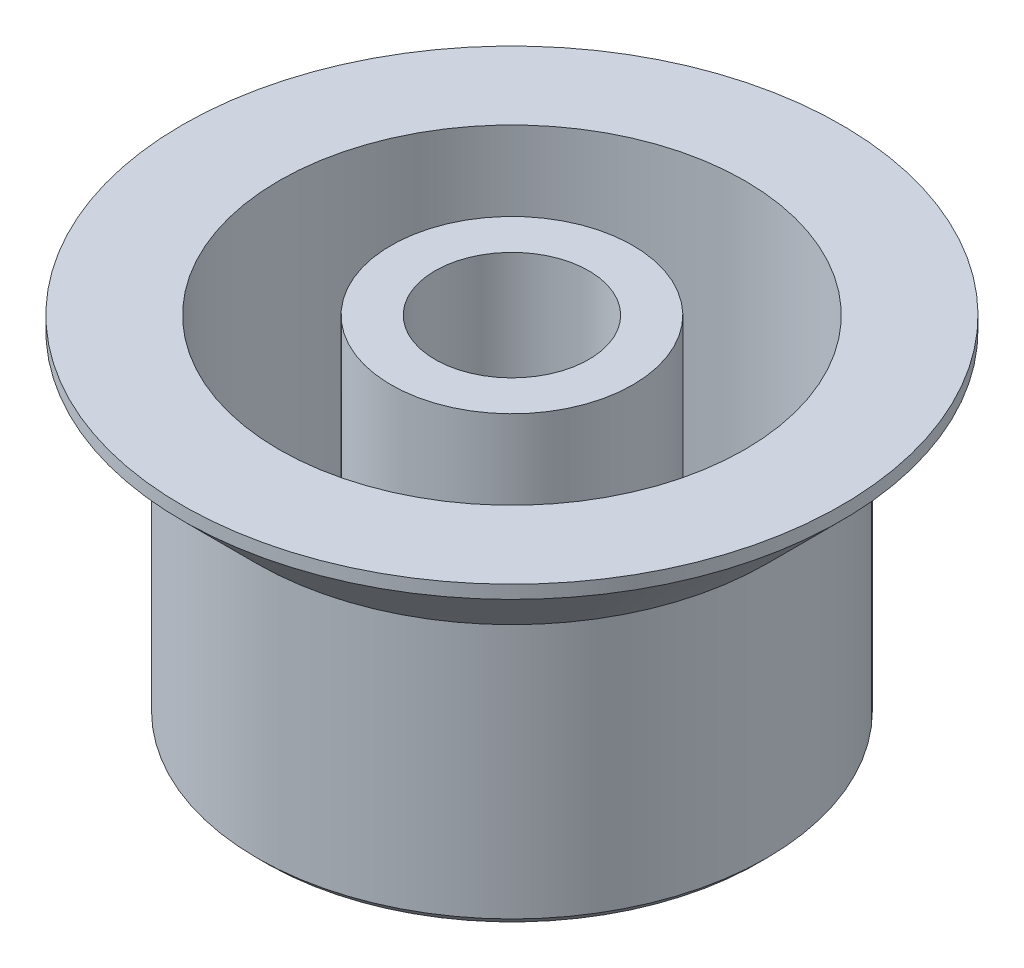
ISO-10303-21;
HEADER;
FILE_DESCRIPTION(('STEP AP214'),'2;1');
FILE_NAME('part.step','',(''),(''),'','','');
FILE_SCHEMA(('AUTOMOTIVE_DESIGN { 1 0 10303 214 1 1 1 1 }'));
ENDSEC;
DATA;
#1=APPLICATION_CONTEXT('core data for automotive mechanical design processes');
#2=APPLICATION_PROTOCOL_DEFINITION('international standard','automotive_design',2000,#1);
#3=PRODUCT_CONTEXT('',#1,'mechanical');
#4=PRODUCT('Part','Part','',(#3));
#5=PRODUCT_RELATED_PRODUCT_CATEGORY('part','',(#4));
#6=PRODUCT_DEFINITION_FORMATION('','',#4);
#7=PRODUCT_DEFINITION_CONTEXT('part definition',#1,'design');
#8=PRODUCT_DEFINITION('design','',#6,#7);
#9=PRODUCT_DEFINITION_SHAPE('','',#8);
#10=(LENGTH_UNIT() NAMED_UNIT(*) SI_UNIT(.MILLI.,.METRE.));
#11=(NAMED_UNIT(*) PLANE_ANGLE_UNIT() SI_UNIT($,.RADIAN.));
#12=(NAMED_UNIT(*) SI_UNIT($,.STERADIAN.) SOLID_ANGLE_UNIT());
#13=UNCERTAINTY_MEASURE_WITH_UNIT(LENGTH_MEASURE(1.E-05),#10,'distance_accuracy_value','');
#14=(GEOMETRIC_REPRESENTATION_CONTEXT(3) GLOBAL_UNCERTAINTY_ASSIGNED_CONTEXT((#13)) GLOBAL_UNIT_ASSIGNED_CONTEXT((#10,
#11,#12)) REPRESENTATION_CONTEXT('',''));
#15=CARTESIAN_POINT('',(0.,0.,0.));
#16=DIRECTION('',(0.,0.,1.));
#17=DIRECTION('',(1.,0.,0.));
#18=AXIS2_PLACEMENT_3D('',#15,#16,#17);
#19=CARTESIAN_POINT('',(166.750080550188,-36.9999315973919,-82.7209999999947));
#20=DIRECTION('',(0.,-1.,0.));
#21=DIRECTION('',(-1.,0.,0.));
#22=AXIS2_PLACEMENT_3D('',#19,#20,#21);
#23=CYLINDRICAL_SURFACE('',#22,5.5);
#24=CARTESIAN_POINT('',(166.750080550188,-36.9999315973919,-82.7209999999947));
#25=DIRECTION('',(0.,1.,0.));
#26=DIRECTION('',(-1.,0.,0.));
#27=AXIS2_PLACEMENT_3D('',#24,#25,#26);
#28=CIRCLE('',#27,5.5);
#29=CARTESIAN_POINT('',(172.250080550188,-36.9999315973919,-82.7209999999947));
#30=VERTEX_POINT('',#29);
#31=EDGE_CURVE('P0_E130',#30,#30,#28,.T.);
#32=ORIENTED_EDGE('',*,*,#31,.F.);
#33=DIRECTION('',(0.,-1.,0.));
#34=VECTOR('',#33,1.);
#35=CARTESIAN_POINT('',(172.250080550188,-36.9999315973919,-82.7209999999947));
#36=LINE('',#35,#34);
#37=CARTESIAN_POINT('',(172.250080550188,-50.9999315973919,-82.7209999999947));
#38=VERTEX_POINT('',#37);
#39=EDGE_CURVE('P0_E11',#30,#38,#36,.T.);
#40=ORIENTED_EDGE('',*,*,#39,.T.);
#41=CARTESIAN_POINT('',(166.750080550188,-50.9999315973919,-82.7209999999947));
#42=DIRECTION('',(0.,1.,0.));
#43=DIRECTION('',(-1.,0.,0.));
#44=AXIS2_PLACEMENT_3D('',#41,#42,#43);
#45=CIRCLE('',#44,5.5);
#46=EDGE_CURVE('P0_E121',#38,#38,#45,.T.);
#47=ORIENTED_EDGE('',*,*,#46,.T.);
#48=ORIENTED_EDGE('',*,*,#39,.F.);
#49=EDGE_LOOP('',(#32,#40,#47,#48));
#50=FACE_BOUND('',#49,.T.);
#51=ADVANCED_FACE('P0_F17',(#50),#23,.T.);
#52=CARTESIAN_POINT('',(166.750080550188,-36.9999315973919,-82.7209999999947));
#53=DIRECTION('',(0.,-1.,0.));
#54=DIRECTION('',(-1.,0.,0.));
#55=AXIS2_PLACEMENT_3D('',#52,#53,#54);
#56=CYLINDRICAL_SURFACE('',#55,10.6);
#57=CARTESIAN_POINT('',(166.750080550188,-36.9999315973919,-82.7209999999947));
#58=DIRECTION('',(0.,-1.,0.));
#59=DIRECTION('',(-1.,0.,0.));
#60=AXIS2_PLACEMENT_3D('',#57,#58,#59);
#61=CIRCLE('',#60,10.6);
#62=CARTESIAN_POINT('',(177.350080550188,-36.9999315973919,-82.7209999999947));
#63=VERTEX_POINT('',#62);
#64=EDGE_CURVE('P0_E122',#63,#63,#61,.T.);
#65=ORIENTED_EDGE('',*,*,#64,.F.);
#66=DIRECTION('',(0.,-1.,0.));
#67=VECTOR('',#66,1.);
#68=CARTESIAN_POINT('',(177.350080550188,-36.9999315973919,-82.7209999999947));
#69=LINE('',#68,#67);
#70=CARTESIAN_POINT('',(177.350080550188,-50.9999315973919,-82.7209999999947));
#71=VERTEX_POINT('',#70);
#72=EDGE_CURVE('P0_E27',#63,#71,#69,.T.);
#73=ORIENTED_EDGE('',*,*,#72,.T.);
#74=CARTESIAN_POINT('',(166.750080550188,-50.9999315973919,-82.7209999999947));
#75=DIRECTION('',(0.,-1.,0.));
#76=DIRECTION('',(-1.,0.,0.));
#77=AXIS2_PLACEMENT_3D('',#74,#75,#76);
#78=CIRCLE('',#77,10.6);
#79=EDGE_CURVE('P0_E118',#71,#71,#78,.T.);
#80=ORIENTED_EDGE('',*,*,#79,.T.);
#81=ORIENTED_EDGE('',*,*,#72,.F.);
#82=EDGE_LOOP('',(#65,#73,#80,#81));
#83=FACE_BOUND('',#82,.T.);
#84=ADVANCED_FACE('P0_F165',(#83),#56,.F.);
#85=CARTESIAN_POINT('',(166.750080550188,-50.9999315973919,-82.7209999999947));
#86=DIRECTION('',(0.,1.,0.));
#87=DIRECTION('',(1.,0.,0.));
#88=AXIS2_PLACEMENT_3D('',#85,#86,#87);
#89=PLANE('',#88);
#90=ORIENTED_EDGE('',*,*,#46,.F.);
#91=EDGE_LOOP('',(#90));
#92=FACE_BOUND('',#91,.T.);
#93=ORIENTED_EDGE('',*,*,#79,.F.);
#94=EDGE_LOOP('',(#93));
#95=FACE_BOUND('',#94,.T.);
#96=ADVANCED_FACE('P0_F161',(#92,#95),#89,.T.);
#97=CARTESIAN_POINT('',(166.750080550188,-36.9999315973919,-82.7209999999947));
#98=DIRECTION('',(0.,1.,0.));
#99=DIRECTION('',(1.,0.,0.));
#100=AXIS2_PLACEMENT_3D('',#97,#98,#99);
#101=PLANE('',#100);
#102=ORIENTED_EDGE('',*,*,#64,.T.);
#103=EDGE_LOOP('',(#102));
#104=FACE_BOUND('',#103,.T.);
#105=CARTESIAN_POINT('',(166.750080550188,-36.9999315973919,-82.7209999999947));
#106=DIRECTION('',(0.,1.,0.));
#107=DIRECTION('',(1.,0.,0.));
#108=AXIS2_PLACEMENT_3D('',#105,#106,#107);
#109=CIRCLE('',#108,15.);
#110=CARTESIAN_POINT('',(151.750080550188,-36.9999315973919,-82.7209999999947));
#111=VERTEX_POINT('',#110);
#112=EDGE_CURVE('P0_E81',#111,#111,#109,.T.);
#113=ORIENTED_EDGE('',*,*,#112,.T.);
#114=EDGE_LOOP('',(#113));
#115=FACE_BOUND('',#114,.T.);
#116=ADVANCED_FACE('P0_F164',(#104,#115),#101,.T.);
#117=CARTESIAN_POINT('',(166.750080550188,-52.9999315973919,-82.7209999999947));
#118=DIRECTION('',(0.,1.,0.));
#119=DIRECTION('',(1.,0.,0.));
#120=AXIS2_PLACEMENT_3D('',#117,#118,#119);
#121=PLANE('',#120);
#122=CARTESIAN_POINT('',(166.750080550188,-52.9999315973919,-82.7209999999947));
#123=DIRECTION('',(0.,1.,0.));
#124=DIRECTION('',(1.,0.,0.));
#125=AXIS2_PLACEMENT_3D('',#122,#123,#124);
#126=CIRCLE('',#125,11.2);
#127=CARTESIAN_POINT('',(155.550080550188,-52.9999315973919,-82.7209999999947));
#128=VERTEX_POINT('',#127);
#129=EDGE_CURVE('P0_E138',#128,#128,#126,.T.);
#130=ORIENTED_EDGE('',*,*,#129,.F.);
#131=EDGE_LOOP('',(#130));
#132=FACE_BOUND('',#131,.T.);
#133=ADVANCED_FACE('P0_F170',(#132),#121,.F.);
#134=CARTESIAN_POINT('',(166.750080550188,-52.7999315973919,-82.7209999999947));
#135=DIRECTION('',(0.,1.,0.));
#136=DIRECTION('',(1.,0.,0.));
#137=AXIS2_PLACEMENT_3D('',#134,#135,#136);
#138=CONICAL_SURFACE('',#137,11.4,0.785398163397437);
#139=ORIENTED_EDGE('',*,*,#129,.T.);
#140=DIRECTION('',(-0.70710678118654,0.707106781186555,0.));
#141=VECTOR('',#140,1.);
#142=CARTESIAN_POINT('',(155.350080550188,-52.7999315973919,-82.7209999999947));
#143=LINE('',#142,#141);
#144=CARTESIAN_POINT('',(155.150080550188,-52.5999315973919,-82.7209999999947));
#145=VERTEX_POINT('',#144);
#146=EDGE_CURVE('P0_E141',#128,#145,#143,.T.);
#147=ORIENTED_EDGE('',*,*,#146,.T.);
#148=CARTESIAN_POINT('',(166.750080550188,-52.5999315973919,-82.7209999999947));
#149=DIRECTION('',(0.,-1.,0.));
#150=DIRECTION('',(1.,0.,0.));
#151=AXIS2_PLACEMENT_3D('',#148,#149,#150);
#152=CIRCLE('',#151,11.6);
#153=EDGE_CURVE('P0_E117',#145,#145,#152,.T.);
#154=ORIENTED_EDGE('',*,*,#153,.T.);
#155=ORIENTED_EDGE('',*,*,#146,.F.);
#156=EDGE_LOOP('',(#139,#147,#154,#155));
#157=FACE_BOUND('',#156,.T.);
#158=ADVANCED_FACE('P0_F176',(#157),#138,.T.);
#159=CARTESIAN_POINT('',(166.750080550188,-52.9999315973919,-82.7209999999947));
#160=DIRECTION('',(0.,1.,0.));
#161=DIRECTION('',(1.,0.,0.));
#162=AXIS2_PLACEMENT_3D('',#159,#160,#161);
#163=CYLINDRICAL_SURFACE('',#162,11.6);
#164=ORIENTED_EDGE('',*,*,#153,.F.);
#165=DIRECTION('',(0.,1.,0.));
#166=VECTOR('',#165,1.);
#167=CARTESIAN_POINT('',(155.150080550188,-52.9999315973919,-82.7209999999947));
#168=LINE('',#167,#166);
#169=CARTESIAN_POINT('',(155.150080550188,-40.9999315973919,-82.7209999999947));
#170=VERTEX_POINT('',#169);
#171=EDGE_CURVE('P0_E135',#145,#170,#168,.T.);
#172=ORIENTED_EDGE('',*,*,#171,.T.);
#173=CARTESIAN_POINT('',(166.750080550188,-40.9999315973919,-82.7209999999947));
#174=DIRECTION('',(0.,-1.,0.));
#175=DIRECTION('',(1.,0.,0.));
#176=AXIS2_PLACEMENT_3D('',#173,#174,#175);
#177=CIRCLE('',#176,11.6);
#178=EDGE_CURVE('P0_E95',#170,#170,#177,.T.);
#179=ORIENTED_EDGE('',*,*,#178,.T.);
#180=ORIENTED_EDGE('',*,*,#171,.F.);
#181=EDGE_LOOP('',(#164,#172,#179,#180));
#182=FACE_BOUND('',#181,.T.);
#183=ADVANCED_FACE('P0_F186',(#182),#163,.T.);
#184=CARTESIAN_POINT('',(166.750080550188,-39.2999315973919,-82.7209999999947));
#185=DIRECTION('',(0.,1.,0.));
#186=DIRECTION('',(1.,0.,0.));
#187=AXIS2_PLACEMENT_3D('',#184,#185,#186);
#188=CONICAL_SURFACE('',#187,13.3,0.785398163397448);
#189=CARTESIAN_POINT('',(166.750080550188,-37.5999315973919,-82.7209999999947));
#190=DIRECTION('',(0.,-1.,0.));
#191=DIRECTION('',(1.,0.,0.));
#192=AXIS2_PLACEMENT_3D('',#189,#190,#191);
#193=CIRCLE('',#192,15.);
#194=CARTESIAN_POINT('',(151.750080550188,-37.5999315973919,-82.7209999999947));
#195=VERTEX_POINT('',#194);
#196=EDGE_CURVE('P0_E93',#195,#195,#193,.T.);
#197=ORIENTED_EDGE('',*,*,#196,.T.);
#198=DIRECTION('',(0.707106781186548,-0.707106781186548,0.));
#199=VECTOR('',#198,1.);
#200=CARTESIAN_POINT('',(153.450080550188,-39.2999315973919,-82.7209999999947));
#201=LINE('',#200,#199);
#202=EDGE_CURVE('P0_E89',#195,#170,#201,.T.);
#203=ORIENTED_EDGE('',*,*,#202,.T.);
#204=ORIENTED_EDGE('',*,*,#178,.F.);
#205=ORIENTED_EDGE('',*,*,#202,.F.);
#206=EDGE_LOOP('',(#197,#203,#204,#205));
#207=FACE_BOUND('',#206,.T.);
#208=ADVANCED_FACE('P0_F91',(#207),#188,.T.);
#209=CARTESIAN_POINT('',(166.750080550188,-36.9999315973919,-82.7209999999947));
#210=DIRECTION('',(0.,-1.,0.));
#211=DIRECTION('',(1.,0.,0.));
#212=AXIS2_PLACEMENT_3D('',#209,#210,#211);
#213=CYLINDRICAL_SURFACE('',#212,15.);
#214=ORIENTED_EDGE('',*,*,#196,.F.);
#215=DIRECTION('',(0.,1.,0.));
#216=VECTOR('',#215,1.);
#217=CARTESIAN_POINT('',(151.750080550188,-36.9999315973919,-82.7209999999947));
#218=LINE('',#217,#216);
#219=EDGE_CURVE('P0_E100',#195,#111,#218,.T.);
#220=ORIENTED_EDGE('',*,*,#219,.T.);
#221=ORIENTED_EDGE('',*,*,#112,.F.);
#222=ORIENTED_EDGE('',*,*,#219,.F.);
#223=EDGE_LOOP('',(#214,#220,#221,#222));
#224=FACE_BOUND('',#223,.T.);
#225=ADVANCED_FACE('P0_F101',(#224),#213,.T.);
#226=CARTESIAN_POINT('',(166.750080550188,-50.9999315973919,-82.7209999999947));
#227=DIRECTION('',(0.,-1.,0.));
#228=DIRECTION('',(0.,0.,-1.));
#229=AXIS2_PLACEMENT_3D('',#226,#227,#228);
#230=PLANE('',#229);
#231=CARTESIAN_POINT('',(166.750080550188,-50.9999315973919,-82.7209999999947));
#232=DIRECTION('',(0.,-1.,0.));
#233=DIRECTION('',(1.,0.,0.));
#234=AXIS2_PLACEMENT_3D('',#231,#232,#233);
#235=CIRCLE('',#234,3.5);
#236=CARTESIAN_POINT('',(163.250080550188,-50.9999315973919,-82.7209999999947));
#237=VERTEX_POINT('',#236);
#238=EDGE_CURVE('P0_E113',#237,#237,#235,.T.);
#239=ORIENTED_EDGE('',*,*,#238,.F.);
#240=EDGE_LOOP('',(#239));
#241=FACE_BOUND('',#240,.T.);
#242=ADVANCED_FACE('P0_F19',(#241),#230,.F.);
#243=CARTESIAN_POINT('',(166.750080550188,-36.9999315973919,-82.7209999999947));
#244=DIRECTION('',(0.,-1.,0.));
#245=DIRECTION('',(1.,0.,0.));
#246=AXIS2_PLACEMENT_3D('',#243,#244,#245);
#247=CYLINDRICAL_SURFACE('',#246,3.5);
#248=ORIENTED_EDGE('',*,*,#238,.T.);
#249=DIRECTION('',(0.,1.,0.));
#250=VECTOR('',#249,1.);
#251=CARTESIAN_POINT('',(163.250080550188,-36.9999315973919,-82.7209999999947));
#252=LINE('',#251,#250);
#253=CARTESIAN_POINT('',(163.250080550188,-36.9999315973919,-82.7209999999947));
#254=VERTEX_POINT('',#253);
#255=EDGE_CURVE('P0_E21',#237,#254,#252,.T.);
#256=ORIENTED_EDGE('',*,*,#255,.T.);
#257=CARTESIAN_POINT('',(166.750080550188,-36.9999315973919,-82.7209999999947));
#258=DIRECTION('',(0.,1.,0.));
#259=DIRECTION('',(1.,0.,0.));
#260=AXIS2_PLACEMENT_3D('',#257,#258,#259);
#261=CIRCLE('',#260,3.5);
#262=EDGE_CURVE('P0_E127',#254,#254,#261,.T.);
#263=ORIENTED_EDGE('',*,*,#262,.T.);
#264=ORIENTED_EDGE('',*,*,#255,.F.);
#265=EDGE_LOOP('',(#248,#256,#263,#264));
#266=FACE_BOUND('',#265,.T.);
#267=ADVANCED_FACE('P0_F194',(#266),#247,.F.);
#268=CARTESIAN_POINT('',(166.750080550188,-36.9999315973919,-82.7209999999947));
#269=DIRECTION('',(0.,1.,0.));
#270=DIRECTION('',(1.,0.,0.));
#271=AXIS2_PLACEMENT_3D('',#268,#269,#270);
#272=PLANE('',#271);
#273=ORIENTED_EDGE('',*,*,#262,.F.);
#274=EDGE_LOOP('',(#273));
#275=FACE_BOUND('',#274,.T.);
#276=ORIENTED_EDGE('',*,*,#31,.T.);
#277=EDGE_LOOP('',(#276));
#278=FACE_BOUND('',#277,.T.);
#279=ADVANCED_FACE('P0_F158',(#275,#278),#272,.T.);
#280=CLOSED_SHELL('',(#51,#84,#96,#116,#133,#158,#183,#208,#225,#242,#267,#279));
#281=MANIFOLD_SOLID_BREP('P0_B1',#280);
#282=CARTESIAN_POINT('',(166.750080550188,-52.9999315973919,-82.7209999999947));
#283=DIRECTION('',(0.,-1.,0.));
#284=DIRECTION('',(1.,0.,0.));
#285=AXIS2_PLACEMENT_3D('',#282,#283,#284);
#286=CYLINDRICAL_SURFACE('',#285,10.8);
#287=CARTESIAN_POINT('',(166.750080550188,-53.0999315973919,-82.7209999999947));
#288=DIRECTION('',(0.,-1.,0.));
#289=DIRECTION('',(1.,0.,0.));
#290=AXIS2_PLACEMENT_3D('',#287,#288,#289);
#291=CIRCLE('',#290,10.8);
#292=CARTESIAN_POINT('',(155.950080550188,-53.0999315973919,-82.7209999999947));
#293=VERTEX_POINT('',#292);
#294=CARTESIAN_POINT('',(166.750080550188,-53.0999315973919,-71.9209999999947));
#295=VERTEX_POINT('',#294);
#296=EDGE_CURVE('P1_E28',#293,#295,#291,.T.);
#297=ORIENTED_EDGE('',*,*,#296,.F.);
#298=DIRECTION('',(0.,1.,0.));
#299=VECTOR('',#298,1.);
#300=CARTESIAN_POINT('',(155.950080550188,-52.9999315973919,-82.7209999999947));
#301=LINE('',#300,#299);
#302=CARTESIAN_POINT('',(155.950080550188,-52.9999315973919,-82.7209999999947));
#303=VERTEX_POINT('',#302);
#304=EDGE_CURVE('P1_E11',#293,#303,#301,.T.);
#305=ORIENTED_EDGE('',*,*,#304,.T.);
#306=CARTESIAN_POINT('',(166.750080550188,-52.9999315973919,-82.7209999999947));
#307=DIRECTION('',(0.,1.,0.));
#308=DIRECTION('',(1.,0.,0.));
#309=AXIS2_PLACEMENT_3D('',#306,#307,#308);
#310=CIRCLE('',#309,10.8);
#311=EDGE_CURVE('P1_E92',#303,#303,#310,.T.);
#312=ORIENTED_EDGE('',*,*,#311,.F.);
#313=ORIENTED_EDGE('',*,*,#304,.F.);
#314=CARTESIAN_POINT('',(166.750080550188,-53.0999315973919,-82.7209999999947));
#315=DIRECTION('',(0.,-1.,0.));
#316=DIRECTION('',(1.,0.,0.));
#317=AXIS2_PLACEMENT_3D('',#314,#315,#316);
#318=CIRCLE('',#317,10.8);
#319=EDGE_CURVE('P1_E82',#295,#293,#318,.T.);
#320=ORIENTED_EDGE('',*,*,#319,.F.);
#321=EDGE_LOOP('',(#297,#305,#312,#313,#320));
#322=FACE_BOUND('',#321,.T.);
#323=ADVANCED_FACE('P1_F17',(#322),#286,.T.);
#324=CARTESIAN_POINT('',(166.750080550188,-53.0999315973919,-82.7209999999947));
#325=DIRECTION('',(0.,-1.,0.));
#326=DIRECTION('',(0.,0.,-1.));
#327=AXIS2_PLACEMENT_3D('',#324,#325,#326);
#328=TOROIDAL_SURFACE('',#327,10.7,0.1);
#329=CARTESIAN_POINT('',(166.750080550188,-53.1999315973919,-82.7209999999947));
#330=DIRECTION('',(0.,1.,0.));
#331=DIRECTION('',(1.,0.,0.));
#332=AXIS2_PLACEMENT_3D('',#329,#330,#331);
#333=CIRCLE('',#332,10.7);
#334=CARTESIAN_POINT('',(166.750080550188,-53.1999315973919,-72.0209999999947));
#335=VERTEX_POINT('',#334);
#336=EDGE_CURVE('P1_E79',#335,#335,#333,.T.);
#337=ORIENTED_EDGE('',*,*,#336,.T.);
#338=CARTESIAN_POINT('',(166.750080550188,-53.0999315973919,-72.0209999999947));
#339=DIRECTION('',(-1.,0.,0.));
#340=DIRECTION('',(0.,0.,1.));
#341=AXIS2_PLACEMENT_3D('',#338,#339,#340);
#342=CIRCLE('',#341,0.1);
#343=EDGE_CURVE('P1_E76',#335,#295,#342,.T.);
#344=ORIENTED_EDGE('',*,*,#343,.T.);
#345=ORIENTED_EDGE('',*,*,#319,.T.);
#346=ORIENTED_EDGE('',*,*,#296,.T.);
#347=ORIENTED_EDGE('',*,*,#343,.F.);
#348=EDGE_LOOP('',(#337,#344,#345,#346,#347));
#349=FACE_BOUND('',#348,.T.);
#350=ADVANCED_FACE('P1_F77',(#349),#328,.T.);
#351=CARTESIAN_POINT('',(166.750080550188,-52.9999315973919,-82.7209999999947));
#352=DIRECTION('',(0.,-1.,0.));
#353=DIRECTION('',(1.,0.,0.));
#354=AXIS2_PLACEMENT_3D('',#351,#352,#353);
#355=CYLINDRICAL_SURFACE('',#354,9.8);
#356=CARTESIAN_POINT('',(166.750080550188,-53.0999315973919,-82.7209999999947));
#357=DIRECTION('',(0.,1.,0.));
#358=DIRECTION('',(1.,0.,0.));
#359=AXIS2_PLACEMENT_3D('',#356,#357,#358);
#360=CIRCLE('',#359,9.8);
#361=CARTESIAN_POINT('',(156.950080550188,-53.0999315973919,-82.7209999999947));
#362=VERTEX_POINT('',#361);
#363=CARTESIAN_POINT('',(166.750080550188,-53.0999315973919,-92.5209999999947));
#364=VERTEX_POINT('',#363);
#365=EDGE_CURVE('P1_E21',#362,#364,#360,.T.);
#366=ORIENTED_EDGE('',*,*,#365,.F.);
#367=DIRECTION('',(0.,1.,0.));
#368=VECTOR('',#367,1.);
#369=CARTESIAN_POINT('',(156.950080550188,-52.9999315973919,-82.7209999999947));
#370=LINE('',#369,#368);
#371=CARTESIAN_POINT('',(156.950080550188,-52.9999315973919,-82.7209999999947));
#372=VERTEX_POINT('',#371);
#373=EDGE_CURVE('P1_E70',#362,#372,#370,.T.);
#374=ORIENTED_EDGE('',*,*,#373,.T.);
#375=CARTESIAN_POINT('',(166.750080550188,-52.9999315973919,-82.7209999999947));
#376=DIRECTION('',(0.,-1.,0.));
#377=DIRECTION('',(1.,0.,0.));
#378=AXIS2_PLACEMENT_3D('',#375,#376,#377);
#379=CIRCLE('',#378,9.8);
#380=EDGE_CURVE('P1_E96',#372,#372,#379,.T.);
#381=ORIENTED_EDGE('',*,*,#380,.F.);
#382=ORIENTED_EDGE('',*,*,#373,.F.);
#383=CARTESIAN_POINT('',(166.750080550188,-53.0999315973919,-82.7209999999947));
#384=DIRECTION('',(0.,1.,0.));
#385=DIRECTION('',(1.,0.,0.));
#386=AXIS2_PLACEMENT_3D('',#383,#384,#385);
#387=CIRCLE('',#386,9.8);
#388=EDGE_CURVE('P1_E97',#364,#362,#387,.T.);
#389=ORIENTED_EDGE('',*,*,#388,.F.);
#390=EDGE_LOOP('',(#366,#374,#381,#382,#389));
#391=FACE_BOUND('',#390,.T.);
#392=ADVANCED_FACE('P1_F181',(#391),#355,.F.);
#393=CARTESIAN_POINT('',(166.750080550188,-53.1999315973919,-82.7209999999947));
#394=DIRECTION('',(0.,-1.,0.));
#395=DIRECTION('',(0.,0.,-1.));
#396=AXIS2_PLACEMENT_3D('',#393,#394,#395);
#397=PLANE('',#396);
#398=CARTESIAN_POINT('',(166.750080550188,-53.1999315973919,-82.7209999999947));
#399=DIRECTION('',(0.,-1.,0.));
#400=DIRECTION('',(1.,0.,0.));
#401=AXIS2_PLACEMENT_3D('',#398,#399,#400);
#402=CIRCLE('',#401,9.9);
#403=CARTESIAN_POINT('',(166.750080550188,-53.1999315973919,-92.6209999999947));
#404=VERTEX_POINT('',#403);
#405=EDGE_CURVE('P1_E104',#404,#404,#402,.T.);
#406=ORIENTED_EDGE('',*,*,#405,.F.);
#407=EDGE_LOOP('',(#406));
#408=FACE_BOUND('',#407,.T.);
#409=ORIENTED_EDGE('',*,*,#336,.F.);
#410=EDGE_LOOP('',(#409));
#411=FACE_BOUND('',#410,.T.);
#412=ADVANCED_FACE('P1_F19',(#408,#411),#397,.T.);
#413=CARTESIAN_POINT('',(166.750080550188,-53.0999315973919,-82.7209999999947));
#414=DIRECTION('',(0.,1.,0.));
#415=DIRECTION('',(0.,0.,1.));
#416=AXIS2_PLACEMENT_3D('',#413,#414,#415);
#417=TOROIDAL_SURFACE('',#416,9.9,0.1);
#418=ORIENTED_EDGE('',*,*,#405,.T.);
#419=CARTESIAN_POINT('',(166.750080550188,-53.0999315973919,-92.6209999999947));
#420=DIRECTION('',(-1.,0.,0.));
#421=DIRECTION('',(0.,0.,-1.));
#422=AXIS2_PLACEMENT_3D('',#419,#420,#421);
#423=CIRCLE('',#422,0.1);
#424=EDGE_CURVE('P1_E100',#404,#364,#423,.T.);
#425=ORIENTED_EDGE('',*,*,#424,.T.);
#426=ORIENTED_EDGE('',*,*,#388,.T.);
#427=ORIENTED_EDGE('',*,*,#365,.T.);
#428=ORIENTED_EDGE('',*,*,#424,.F.);
#429=EDGE_LOOP('',(#418,#425,#426,#427,#428));
#430=FACE_BOUND('',#429,.T.);
#431=ADVANCED_FACE('P1_F160',(#430),#417,.T.);
#432=CARTESIAN_POINT('',(166.750080550188,-52.9999315973919,-82.7209999999947));
#433=DIRECTION('',(0.,-1.,0.));
#434=DIRECTION('',(0.,0.,-1.));
#435=AXIS2_PLACEMENT_3D('',#432,#433,#434);
#436=PLANE('',#435);
#437=ORIENTED_EDGE('',*,*,#380,.T.);
#438=EDGE_LOOP('',(#437));
#439=FACE_BOUND('',#438,.T.);
#440=ORIENTED_EDGE('',*,*,#311,.T.);
#441=EDGE_LOOP('',(#440));
#442=FACE_BOUND('',#441,.T.);
#443=ADVANCED_FACE('P1_F154',(#439,#442),#436,.F.);
#444=CLOSED_SHELL('',(#323,#350,#392,#412,#431,#443));
#445=MANIFOLD_SOLID_BREP('P1_B1',#444);
#446=ADVANCED_BREP_SHAPE_REPRESENTATION('',(#18,#281,#445),#14);
#447=SHAPE_DEFINITION_REPRESENTATION(#9,#446);
ENDSEC;
END-ISO-10303-21;
